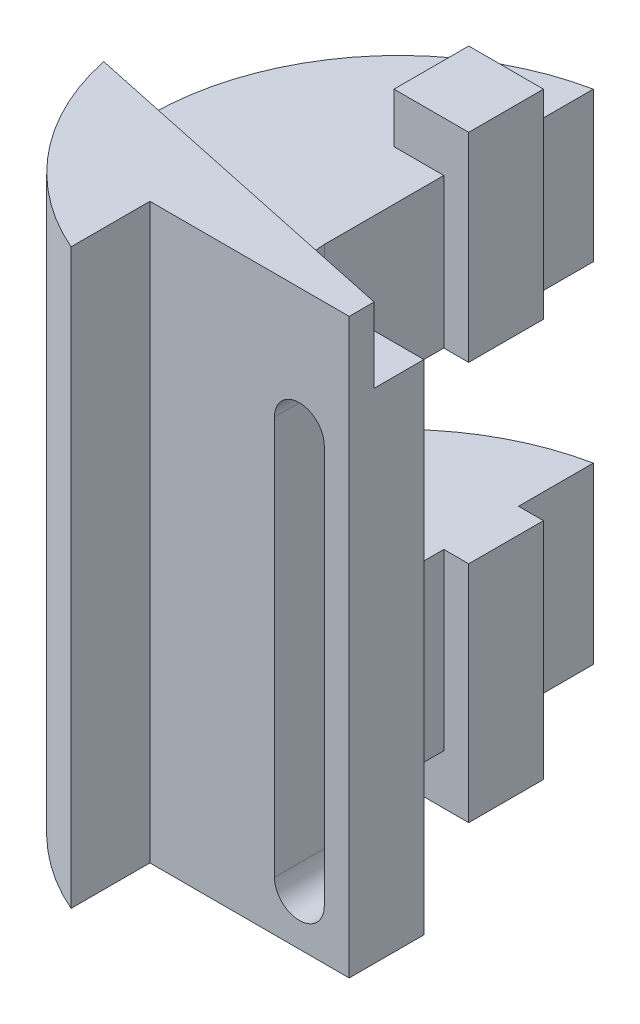
ISO-10303-21;
HEADER;
FILE_DESCRIPTION(('STEP AP214'),'2;1');
FILE_NAME('part.step','',(''),(''),'','','');
FILE_SCHEMA(('AUTOMOTIVE_DESIGN { 1 0 10303 214 1 1 1 1 }'));
ENDSEC;
DATA;
#1=APPLICATION_CONTEXT('core data for automotive mechanical design processes');
#2=APPLICATION_PROTOCOL_DEFINITION('international standard','automotive_design',2000,#1);
#3=PRODUCT_CONTEXT('',#1,'mechanical');
#4=PRODUCT('Part','Part','',(#3));
#5=PRODUCT_RELATED_PRODUCT_CATEGORY('part','',(#4));
#6=PRODUCT_DEFINITION_FORMATION('','',#4);
#7=PRODUCT_DEFINITION_CONTEXT('part definition',#1,'design');
#8=PRODUCT_DEFINITION('design','',#6,#7);
#9=PRODUCT_DEFINITION_SHAPE('','',#8);
#10=(LENGTH_UNIT() NAMED_UNIT(*) SI_UNIT(.MILLI.,.METRE.));
#11=(NAMED_UNIT(*) PLANE_ANGLE_UNIT() SI_UNIT($,.RADIAN.));
#12=(NAMED_UNIT(*) SI_UNIT($,.STERADIAN.) SOLID_ANGLE_UNIT());
#13=UNCERTAINTY_MEASURE_WITH_UNIT(LENGTH_MEASURE(1.E-05),#10,'distance_accuracy_value','');
#14=(GEOMETRIC_REPRESENTATION_CONTEXT(3) GLOBAL_UNCERTAINTY_ASSIGNED_CONTEXT((#13)) GLOBAL_UNIT_ASSIGNED_CONTEXT((#10,
#11,#12)) REPRESENTATION_CONTEXT('',''));
#15=CARTESIAN_POINT('',(0.,0.,0.));
#16=DIRECTION('',(0.,0.,1.));
#17=DIRECTION('',(1.,0.,0.));
#18=AXIS2_PLACEMENT_3D('',#15,#16,#17);
#19=CARTESIAN_POINT('',(-30.,125.,-15.));
#20=DIRECTION('',(0.,0.,1.));
#21=DIRECTION('',(1.,0.,0.));
#22=AXIS2_PLACEMENT_3D('',#19,#20,#21);
#23=PLANE('',#22);
#24=DIRECTION('',(1.,0.,0.));
#25=VECTOR('',#24,1.);
#26=CARTESIAN_POINT('',(-30.,10.,-15.));
#27=LINE('',#26,#25);
#28=CARTESIAN_POINT('',(-20.,10.,-15.));
#29=VERTEX_POINT('',#28);
#30=CARTESIAN_POINT('',(0.,10.,-15.));
#31=VERTEX_POINT('',#30);
#32=EDGE_CURVE('E342',#29,#31,#27,.T.);
#33=ORIENTED_EDGE('',*,*,#32,.F.);
#34=DIRECTION('',(0.,-1.,0.));
#35=VECTOR('',#34,1.);
#36=CARTESIAN_POINT('',(-20.,110.,-15.));
#37=LINE('',#36,#35);
#38=CARTESIAN_POINT('',(-20.,110.,-15.));
#39=VERTEX_POINT('',#38);
#40=EDGE_CURVE('E419',#29,#39,#37,.F.);
#41=ORIENTED_EDGE('',*,*,#40,.T.);
#42=DIRECTION('',(-1.,0.,0.));
#43=VECTOR('',#42,1.);
#44=CARTESIAN_POINT('',(-30.,110.,-15.));
#45=LINE('',#44,#43);
#46=CARTESIAN_POINT('',(0.,110.,-15.));
#47=VERTEX_POINT('',#46);
#48=EDGE_CURVE('E308',#47,#39,#45,.T.);
#49=ORIENTED_EDGE('',*,*,#48,.F.);
#50=DIRECTION('',(0.,-1.,0.));
#51=VECTOR('',#50,1.);
#52=CARTESIAN_POINT('',(0.,125.,-15.));
#53=LINE('',#52,#51);
#54=EDGE_CURVE('E413',#47,#31,#53,.T.);
#55=ORIENTED_EDGE('',*,*,#54,.T.);
#56=EDGE_LOOP('',(#33,#41,#49,#55));
#57=FACE_BOUND('',#56,.T.);
#58=CARTESIAN_POINT('',(-10.,20.,-15.));
#59=DIRECTION('',(0.,0.,-1.));
#60=DIRECTION('',(-1.,0.,0.));
#61=AXIS2_PLACEMENT_3D('',#58,#59,#60);
#62=CIRCLE('',#61,5.);
#63=CARTESIAN_POINT('',(-15.,20.,-15.));
#64=VERTEX_POINT('',#63);
#65=CARTESIAN_POINT('',(-5.,20.,-15.));
#66=VERTEX_POINT('',#65);
#67=EDGE_CURVE('E234',#64,#66,#62,.F.);
#68=ORIENTED_EDGE('',*,*,#67,.T.);
#69=DIRECTION('',(0.,-1.,0.));
#70=VECTOR('',#69,1.);
#71=CARTESIAN_POINT('',(-5.00000000000001,0.,-15.));
#72=LINE('',#71,#70);
#73=CARTESIAN_POINT('',(-5.,100.,-15.));
#74=VERTEX_POINT('',#73);
#75=EDGE_CURVE('E52',#74,#66,#72,.T.);
#76=ORIENTED_EDGE('',*,*,#75,.F.);
#77=CARTESIAN_POINT('',(-10.,100.,-15.));
#78=DIRECTION('',(0.,0.,-1.));
#79=DIRECTION('',(-1.,0.,0.));
#80=AXIS2_PLACEMENT_3D('',#77,#78,#79);
#81=CIRCLE('',#80,5.);
#82=CARTESIAN_POINT('',(-15.,100.,-15.));
#83=VERTEX_POINT('',#82);
#84=EDGE_CURVE('E239',#83,#74,#81,.T.);
#85=ORIENTED_EDGE('',*,*,#84,.F.);
#86=DIRECTION('',(0.,-1.,0.));
#87=VECTOR('',#86,1.);
#88=CARTESIAN_POINT('',(-15.,0.,-15.));
#89=LINE('',#88,#87);
#90=EDGE_CURVE('E225',#83,#64,#89,.T.);
#91=ORIENTED_EDGE('',*,*,#90,.T.);
#92=EDGE_LOOP('',(#68,#76,#85,#91));
#93=FACE_BOUND('',#92,.T.);
#94=ADVANCED_FACE('F37',(#57,#93),#23,.F.);
#95=CARTESIAN_POINT('',(0.,125.,0.));
#96=DIRECTION('',(0.,0.,-1.));
#97=DIRECTION('',(-1.,0.,0.));
#98=AXIS2_PLACEMENT_3D('',#95,#96,#97);
#99=PLANE('',#98);
#100=DIRECTION('',(-1.,0.,0.));
#101=VECTOR('',#100,1.);
#102=CARTESIAN_POINT('',(0.,10.,0.));
#103=LINE('',#102,#101);
#104=CARTESIAN_POINT('',(0.,10.,0.));
#105=VERTEX_POINT('',#104);
#106=CARTESIAN_POINT('',(-40.,10.,0.));
#107=VERTEX_POINT('',#106);
#108=EDGE_CURVE('E346',#105,#107,#103,.T.);
#109=ORIENTED_EDGE('',*,*,#108,.F.);
#110=DIRECTION('',(0.,-1.,0.));
#111=VECTOR('',#110,1.);
#112=CARTESIAN_POINT('',(0.,125.,0.));
#113=LINE('',#112,#111);
#114=CARTESIAN_POINT('',(0.,125.,0.));
#115=VERTEX_POINT('',#114);
#116=EDGE_CURVE('E378',#115,#105,#113,.T.);
#117=ORIENTED_EDGE('',*,*,#116,.F.);
#118=DIRECTION('',(1.,0.,0.));
#119=VECTOR('',#118,1.);
#120=CARTESIAN_POINT('',(0.,125.,0.));
#121=LINE('',#120,#119);
#122=CARTESIAN_POINT('',(-40.,125.,0.));
#123=VERTEX_POINT('',#122);
#124=EDGE_CURVE('E376',#123,#115,#121,.T.);
#125=ORIENTED_EDGE('',*,*,#124,.F.);
#126=DIRECTION('',(0.,-1.,0.));
#127=VECTOR('',#126,1.);
#128=CARTESIAN_POINT('',(-40.,125.,0.));
#129=LINE('',#128,#127);
#130=EDGE_CURVE('E387',#123,#107,#129,.T.);
#131=ORIENTED_EDGE('',*,*,#130,.T.);
#132=EDGE_LOOP('',(#109,#117,#125,#131));
#133=FACE_BOUND('',#132,.T.);
#134=CARTESIAN_POINT('',(-10.,100.,0.));
#135=DIRECTION('',(0.,0.,-1.));
#136=DIRECTION('',(-1.,0.,0.));
#137=AXIS2_PLACEMENT_3D('',#134,#135,#136);
#138=CIRCLE('',#137,5.);
#139=CARTESIAN_POINT('',(-15.,100.,0.));
#140=VERTEX_POINT('',#139);
#141=CARTESIAN_POINT('',(-5.,100.,0.));
#142=VERTEX_POINT('',#141);
#143=EDGE_CURVE('E45',#140,#142,#138,.T.);
#144=ORIENTED_EDGE('',*,*,#143,.T.);
#145=DIRECTION('',(0.,-1.,0.));
#146=VECTOR('',#145,1.);
#147=CARTESIAN_POINT('',(-5.,125.,0.));
#148=LINE('',#147,#146);
#149=CARTESIAN_POINT('',(-5.,20.,0.));
#150=VERTEX_POINT('',#149);
#151=EDGE_CURVE('E11',#142,#150,#148,.T.);
#152=ORIENTED_EDGE('',*,*,#151,.T.);
#153=CARTESIAN_POINT('',(-10.,20.,0.));
#154=DIRECTION('',(0.,0.,-1.));
#155=DIRECTION('',(-1.,0.,0.));
#156=AXIS2_PLACEMENT_3D('',#153,#154,#155);
#157=CIRCLE('',#156,5.);
#158=CARTESIAN_POINT('',(-15.,20.,0.));
#159=VERTEX_POINT('',#158);
#160=EDGE_CURVE('E434',#159,#150,#157,.F.);
#161=ORIENTED_EDGE('',*,*,#160,.F.);
#162=DIRECTION('',(0.,-1.,0.));
#163=VECTOR('',#162,1.);
#164=CARTESIAN_POINT('',(-15.,125.,0.));
#165=LINE('',#164,#163);
#166=EDGE_CURVE('E228',#140,#159,#165,.T.);
#167=ORIENTED_EDGE('',*,*,#166,.F.);
#168=EDGE_LOOP('',(#144,#152,#161,#167));
#169=FACE_BOUND('',#168,.T.);
#170=ADVANCED_FACE('F438',(#133,#169),#99,.F.);
#171=CARTESIAN_POINT('',(-20.,110.,-30.));
#172=DIRECTION('',(0.,1.,0.));
#173=DIRECTION('',(0.,0.,1.));
#174=AXIS2_PLACEMENT_3D('',#171,#172,#173);
#175=PLANE('',#174);
#176=CARTESIAN_POINT('',(-20.,110.,-30.));
#177=DIRECTION('',(0.,1.,0.));
#178=DIRECTION('',(0.,0.,1.));
#179=AXIS2_PLACEMENT_3D('',#176,#177,#178);
#180=CIRCLE('',#179,50.);
#181=CARTESIAN_POINT('',(-30.,110.,-78.9897948556636));
#182=VERTEX_POINT('',#181);
#183=CARTESIAN_POINT('',(-68.916774738474,110.,-19.6487126797972));
#184=VERTEX_POINT('',#183);
#185=EDGE_CURVE('E304',#182,#184,#180,.T.);
#186=ORIENTED_EDGE('',*,*,#185,.T.);
#187=DIRECTION('',(-0.978147600733806,0.,-0.207911690817756));
#188=VECTOR('',#187,1.);
#189=CARTESIAN_POINT('',(0.,110.,-5.));
#190=LINE('',#189,#188);
#191=CARTESIAN_POINT('',(0.,110.,-5.));
#192=VERTEX_POINT('',#191);
#193=EDGE_CURVE('E246',#192,#184,#190,.T.);
#194=ORIENTED_EDGE('',*,*,#193,.F.);
#195=DIRECTION('',(0.,0.,-1.));
#196=VECTOR('',#195,1.);
#197=CARTESIAN_POINT('',(0.,110.,-15.));
#198=LINE('',#197,#196);
#199=EDGE_CURVE('E306',#192,#47,#198,.T.);
#200=ORIENTED_EDGE('',*,*,#199,.T.);
#201=ORIENTED_EDGE('',*,*,#48,.T.);
#202=CARTESIAN_POINT('',(-20.,110.,-25.));
#203=DIRECTION('',(0.,1.,0.));
#204=DIRECTION('',(0.,0.,1.));
#205=AXIS2_PLACEMENT_3D('',#202,#203,#204);
#206=CIRCLE('',#205,10.);
#207=CARTESIAN_POINT('',(-30.,110.,-25.));
#208=VERTEX_POINT('',#207);
#209=EDGE_CURVE('E423',#39,#208,#206,.F.);
#210=ORIENTED_EDGE('',*,*,#209,.T.);
#211=DIRECTION('',(0.,0.,-1.));
#212=VECTOR('',#211,1.);
#213=CARTESIAN_POINT('',(-30.,110.,-48.9897948556636));
#214=LINE('',#213,#212);
#215=CARTESIAN_POINT('',(-30.,110.,-48.9897948556636));
#216=VERTEX_POINT('',#215);
#217=EDGE_CURVE('E311',#208,#216,#214,.T.);
#218=ORIENTED_EDGE('',*,*,#217,.T.);
#219=DIRECTION('',(-1.,0.,0.));
#220=VECTOR('',#219,1.);
#221=CARTESIAN_POINT('',(-30.,110.,-48.9897948556636));
#222=LINE('',#221,#220);
#223=CARTESIAN_POINT('',(-40.,110.,-48.9897948556636));
#224=VERTEX_POINT('',#223);
#225=EDGE_CURVE('E313',#216,#224,#222,.T.);
#226=ORIENTED_EDGE('',*,*,#225,.T.);
#227=DIRECTION('',(0.,0.,-1.));
#228=VECTOR('',#227,1.);
#229=CARTESIAN_POINT('',(-40.,110.,-48.9897948556636));
#230=LINE('',#229,#228);
#231=CARTESIAN_POINT('',(-40.,110.,-63.9897948556636));
#232=VERTEX_POINT('',#231);
#233=EDGE_CURVE('E297',#224,#232,#230,.T.);
#234=ORIENTED_EDGE('',*,*,#233,.T.);
#235=DIRECTION('',(1.,0.,0.));
#236=VECTOR('',#235,1.);
#237=CARTESIAN_POINT('',(-30.,110.,-63.9897948556636));
#238=LINE('',#237,#236);
#239=CARTESIAN_POINT('',(-30.,110.,-63.9897948556636));
#240=VERTEX_POINT('',#239);
#241=EDGE_CURVE('E300',#232,#240,#238,.T.);
#242=ORIENTED_EDGE('',*,*,#241,.T.);
#243=DIRECTION('',(0.,0.,-1.));
#244=VECTOR('',#243,1.);
#245=CARTESIAN_POINT('',(-30.,110.,-63.9897948556636));
#246=LINE('',#245,#244);
#247=EDGE_CURVE('E302',#240,#182,#246,.T.);
#248=ORIENTED_EDGE('',*,*,#247,.T.);
#249=EDGE_LOOP('',(#186,#194,#200,#201,#210,#218,#226,#234,#242,#248));
#250=FACE_BOUND('',#249,.T.);
#251=ADVANCED_FACE('F461',(#250),#175,.T.);
#252=CARTESIAN_POINT('',(-30.,125.,-63.9897948556636));
#253=DIRECTION('',(-1.,0.,0.));
#254=DIRECTION('',(0.,0.,1.));
#255=AXIS2_PLACEMENT_3D('',#252,#253,#254);
#256=PLANE('',#255);
#257=DIRECTION('',(0.,-1.,0.));
#258=VECTOR('',#257,1.);
#259=CARTESIAN_POINT('',(-30.,125.,-63.9897948556636));
#260=LINE('',#259,#258);
#261=CARTESIAN_POINT('',(-30.,80.,-63.9897948556636));
#262=VERTEX_POINT('',#261);
#263=EDGE_CURVE('E398',#240,#262,#260,.T.);
#264=ORIENTED_EDGE('',*,*,#263,.T.);
#265=DIRECTION('',(0.,0.,-1.));
#266=VECTOR('',#265,1.);
#267=CARTESIAN_POINT('',(-30.,80.,-63.9897948556636));
#268=LINE('',#267,#266);
#269=CARTESIAN_POINT('',(-30.,80.,-78.9897948556636));
#270=VERTEX_POINT('',#269);
#271=EDGE_CURVE('E281',#262,#270,#268,.T.);
#272=ORIENTED_EDGE('',*,*,#271,.T.);
#273=DIRECTION('',(0.,-1.,0.));
#274=VECTOR('',#273,1.);
#275=CARTESIAN_POINT('',(-30.,125.,-78.9897948556636));
#276=LINE('',#275,#274);
#277=EDGE_CURVE('E394',#182,#270,#276,.T.);
#278=ORIENTED_EDGE('',*,*,#277,.F.);
#279=ORIENTED_EDGE('',*,*,#247,.F.);
#280=EDGE_LOOP('',(#264,#272,#278,#279));
#281=FACE_BOUND('',#280,.T.);
#282=ADVANCED_FACE('F544',(#281),#256,.F.);
#283=CARTESIAN_POINT('',(-25.,125.,-48.9897948556636));
#284=DIRECTION('',(0.,0.,-1.));
#285=DIRECTION('',(-1.,0.,0.));
#286=AXIS2_PLACEMENT_3D('',#283,#284,#285);
#287=PLANE('',#286);
#288=DIRECTION('',(0.,-1.,0.));
#289=VECTOR('',#288,1.);
#290=CARTESIAN_POINT('',(-30.,125.,-48.9897948556636));
#291=LINE('',#290,#289);
#292=CARTESIAN_POINT('',(-30.,80.,-48.9897948556636));
#293=VERTEX_POINT('',#292);
#294=EDGE_CURVE('E410',#216,#293,#291,.T.);
#295=ORIENTED_EDGE('',*,*,#294,.T.);
#296=DIRECTION('',(1.,0.,0.));
#297=VECTOR('',#296,1.);
#298=CARTESIAN_POINT('',(-25.,80.,-48.9897948556636));
#299=LINE('',#298,#297);
#300=CARTESIAN_POINT('',(-25.,80.,-48.9897948556636));
#301=VERTEX_POINT('',#300);
#302=EDGE_CURVE('E290',#293,#301,#299,.T.);
#303=ORIENTED_EDGE('',*,*,#302,.T.);
#304=DIRECTION('',(0.,-1.,0.));
#305=VECTOR('',#304,1.);
#306=CARTESIAN_POINT('',(-25.,125.,-48.9897948556636));
#307=LINE('',#306,#305);
#308=CARTESIAN_POINT('',(-25.,120.,-48.9897948556636));
#309=VERTEX_POINT('',#308);
#310=EDGE_CURVE('E406',#309,#301,#307,.T.);
#311=ORIENTED_EDGE('',*,*,#310,.F.);
#312=DIRECTION('',(1.,0.,0.));
#313=VECTOR('',#312,1.);
#314=CARTESIAN_POINT('',(-30.,120.,-48.9897948556636));
#315=LINE('',#314,#313);
#316=CARTESIAN_POINT('',(-40.,120.,-48.9897948556636));
#317=VERTEX_POINT('',#316);
#318=EDGE_CURVE('E322',#317,#309,#315,.T.);
#319=ORIENTED_EDGE('',*,*,#318,.F.);
#320=DIRECTION('',(0.,1.,0.));
#321=VECTOR('',#320,1.);
#322=CARTESIAN_POINT('',(-40.,110.,-48.9897948556636));
#323=LINE('',#322,#321);
#324=EDGE_CURVE('E319',#224,#317,#323,.T.);
#325=ORIENTED_EDGE('',*,*,#324,.F.);
#326=ORIENTED_EDGE('',*,*,#225,.F.);
#327=EDGE_LOOP('',(#295,#303,#311,#319,#325,#326));
#328=FACE_BOUND('',#327,.T.);
#329=ADVANCED_FACE('F532',(#328),#287,.F.);
#330=CARTESIAN_POINT('',(-25.,125.,-63.9897948556636));
#331=DIRECTION('',(-1.,0.,0.));
#332=DIRECTION('',(0.,0.,1.));
#333=AXIS2_PLACEMENT_3D('',#330,#331,#332);
#334=PLANE('',#333);
#335=ORIENTED_EDGE('',*,*,#310,.T.);
#336=DIRECTION('',(0.,0.,-1.));
#337=VECTOR('',#336,1.);
#338=CARTESIAN_POINT('',(-25.,80.,-63.9897948556636));
#339=LINE('',#338,#337);
#340=CARTESIAN_POINT('',(-25.,80.,-63.9897948556636));
#341=VERTEX_POINT('',#340);
#342=EDGE_CURVE('E287',#301,#341,#339,.T.);
#343=ORIENTED_EDGE('',*,*,#342,.T.);
#344=DIRECTION('',(0.,-1.,0.));
#345=VECTOR('',#344,1.);
#346=CARTESIAN_POINT('',(-25.,125.,-63.9897948556636));
#347=LINE('',#346,#345);
#348=CARTESIAN_POINT('',(-25.,120.,-63.9897948556636));
#349=VERTEX_POINT('',#348);
#350=EDGE_CURVE('E402',#349,#341,#347,.T.);
#351=ORIENTED_EDGE('',*,*,#350,.F.);
#352=DIRECTION('',(0.,0.,-1.));
#353=VECTOR('',#352,1.);
#354=CARTESIAN_POINT('',(-25.,120.,-48.9897948556636));
#355=LINE('',#354,#353);
#356=EDGE_CURVE('E326',#309,#349,#355,.T.);
#357=ORIENTED_EDGE('',*,*,#356,.F.);
#358=EDGE_LOOP('',(#335,#343,#351,#357));
#359=FACE_BOUND('',#358,.T.);
#360=ADVANCED_FACE('F573',(#359),#334,.F.);
#361=CARTESIAN_POINT('',(-30.,125.,-63.9897948556636));
#362=DIRECTION('',(0.,0.,1.));
#363=DIRECTION('',(1.,0.,0.));
#364=AXIS2_PLACEMENT_3D('',#361,#362,#363);
#365=PLANE('',#364);
#366=ORIENTED_EDGE('',*,*,#350,.T.);
#367=DIRECTION('',(-1.,0.,0.));
#368=VECTOR('',#367,1.);
#369=CARTESIAN_POINT('',(-30.,80.,-63.9897948556636));
#370=LINE('',#369,#368);
#371=EDGE_CURVE('E284',#341,#262,#370,.T.);
#372=ORIENTED_EDGE('',*,*,#371,.T.);
#373=ORIENTED_EDGE('',*,*,#263,.F.);
#374=ORIENTED_EDGE('',*,*,#241,.F.);
#375=DIRECTION('',(0.,1.,0.));
#376=VECTOR('',#375,1.);
#377=CARTESIAN_POINT('',(-40.,110.,-63.9897948556636));
#378=LINE('',#377,#376);
#379=CARTESIAN_POINT('',(-40.,120.,-63.9897948556636));
#380=VERTEX_POINT('',#379);
#381=EDGE_CURVE('E316',#232,#380,#378,.T.);
#382=ORIENTED_EDGE('',*,*,#381,.T.);
#383=DIRECTION('',(-1.,0.,0.));
#384=VECTOR('',#383,1.);
#385=CARTESIAN_POINT('',(-25.,120.,-63.9897948556636));
#386=LINE('',#385,#384);
#387=EDGE_CURVE('E328',#349,#380,#386,.T.);
#388=ORIENTED_EDGE('',*,*,#387,.F.);
#389=EDGE_LOOP('',(#366,#372,#373,#374,#382,#388));
#390=FACE_BOUND('',#389,.T.);
#391=ADVANCED_FACE('F483',(#390),#365,.F.);
#392=CARTESIAN_POINT('',(-30.,125.,-15.));
#393=DIRECTION('',(-1.,0.,0.));
#394=DIRECTION('',(0.,0.,1.));
#395=AXIS2_PLACEMENT_3D('',#392,#393,#394);
#396=PLANE('',#395);
#397=DIRECTION('',(0.,1.,0.));
#398=VECTOR('',#397,1.);
#399=CARTESIAN_POINT('',(-30.,125.,-38.9897948556636));
#400=LINE('',#399,#398);
#401=CARTESIAN_POINT('',(-30.,45.,-38.9897948556636));
#402=VERTEX_POINT('',#401);
#403=CARTESIAN_POINT('',(-30.,80.,-38.9897948556636));
#404=VERTEX_POINT('',#403);
#405=EDGE_CURVE('E261',#402,#404,#400,.T.);
#406=ORIENTED_EDGE('',*,*,#405,.T.);
#407=DIRECTION('',(0.,0.,-1.));
#408=VECTOR('',#407,1.);
#409=CARTESIAN_POINT('',(-30.,80.,-15.));
#410=LINE('',#409,#408);
#411=EDGE_CURVE('E293',#404,#293,#410,.T.);
#412=ORIENTED_EDGE('',*,*,#411,.T.);
#413=ORIENTED_EDGE('',*,*,#294,.F.);
#414=ORIENTED_EDGE('',*,*,#217,.F.);
#415=DIRECTION('',(0.,-1.,0.));
#416=VECTOR('',#415,1.);
#417=CARTESIAN_POINT('',(-30.,9.99999999999999,-25.));
#418=LINE('',#417,#416);
#419=CARTESIAN_POINT('',(-30.,10.,-25.));
#420=VERTEX_POINT('',#419);
#421=EDGE_CURVE('E416',#208,#420,#418,.T.);
#422=ORIENTED_EDGE('',*,*,#421,.T.);
#423=DIRECTION('',(0.,0.,1.));
#424=VECTOR('',#423,1.);
#425=CARTESIAN_POINT('',(-30.,10.,-48.9897948556636));
#426=LINE('',#425,#424);
#427=CARTESIAN_POINT('',(-30.,10.,-48.9897948556636));
#428=VERTEX_POINT('',#427);
#429=EDGE_CURVE('E339',#428,#420,#426,.T.);
#430=ORIENTED_EDGE('',*,*,#429,.F.);
#431=CARTESIAN_POINT('',(-30.,45.,-48.9897948556636));
#432=VERTEX_POINT('',#431);
#433=EDGE_CURVE('E409',#432,#428,#291,.T.);
#434=ORIENTED_EDGE('',*,*,#433,.F.);
#435=DIRECTION('',(0.,0.,1.));
#436=VECTOR('',#435,1.);
#437=CARTESIAN_POINT('',(-30.,45.,-15.));
#438=LINE('',#437,#436);
#439=EDGE_CURVE('E278',#432,#402,#438,.T.);
#440=ORIENTED_EDGE('',*,*,#439,.T.);
#441=EDGE_LOOP('',(#406,#412,#413,#414,#422,#430,#434,#440));
#442=FACE_BOUND('',#441,.T.);
#443=ADVANCED_FACE('F466',(#442),#396,.F.);
#444=CARTESIAN_POINT('',(-30.,45.,-78.9897948556636));
#445=VERTEX_POINT('',#444);
#446=CARTESIAN_POINT('',(-30.,10.,-78.9897948556636));
#447=VERTEX_POINT('',#446);
#448=EDGE_CURVE('E393',#445,#447,#276,.T.);
#449=ORIENTED_EDGE('',*,*,#448,.F.);
#450=DIRECTION('',(0.,0.,1.));
#451=VECTOR('',#450,1.);
#452=CARTESIAN_POINT('',(-30.,45.,-63.9897948556636));
#453=LINE('',#452,#451);
#454=CARTESIAN_POINT('',(-30.,45.,-63.9897948556636));
#455=VERTEX_POINT('',#454);
#456=EDGE_CURVE('E266',#445,#455,#453,.T.);
#457=ORIENTED_EDGE('',*,*,#456,.T.);
#458=CARTESIAN_POINT('',(-30.,10.,-63.9897948556636));
#459=VERTEX_POINT('',#458);
#460=EDGE_CURVE('E397',#455,#459,#260,.T.);
#461=ORIENTED_EDGE('',*,*,#460,.T.);
#462=DIRECTION('',(0.,0.,1.));
#463=VECTOR('',#462,1.);
#464=CARTESIAN_POINT('',(-30.,10.,-63.9897948556636));
#465=LINE('',#464,#463);
#466=EDGE_CURVE('E353',#447,#459,#465,.T.);
#467=ORIENTED_EDGE('',*,*,#466,.F.);
#468=EDGE_LOOP('',(#449,#457,#461,#467));
#469=FACE_BOUND('',#468,.T.);
#470=ADVANCED_FACE('F510',(#469),#256,.F.);
#471=CARTESIAN_POINT('',(-25.,45.,-48.9897948556636));
#472=VERTEX_POINT('',#471);
#473=CARTESIAN_POINT('',(-25.,0.,-48.9897948556636));
#474=VERTEX_POINT('',#473);
#475=EDGE_CURVE('E405',#472,#474,#307,.T.);
#476=ORIENTED_EDGE('',*,*,#475,.F.);
#477=DIRECTION('',(-1.,0.,0.));
#478=VECTOR('',#477,1.);
#479=CARTESIAN_POINT('',(-25.,45.,-48.9897948556636));
#480=LINE('',#479,#478);
#481=EDGE_CURVE('E275',#472,#432,#480,.T.);
#482=ORIENTED_EDGE('',*,*,#481,.T.);
#483=ORIENTED_EDGE('',*,*,#433,.T.);
#484=DIRECTION('',(1.,0.,0.));
#485=VECTOR('',#484,1.);
#486=CARTESIAN_POINT('',(-30.,10.,-48.9897948556636));
#487=LINE('',#486,#485);
#488=CARTESIAN_POINT('',(-40.,10.,-48.9897948556636));
#489=VERTEX_POINT('',#488);
#490=EDGE_CURVE('E336',#489,#428,#487,.T.);
#491=ORIENTED_EDGE('',*,*,#490,.F.);
#492=DIRECTION('',(0.,-1.,0.));
#493=VECTOR('',#492,1.);
#494=CARTESIAN_POINT('',(-40.,10.,-48.9897948556636));
#495=LINE('',#494,#493);
#496=CARTESIAN_POINT('',(-40.,0.,-48.9897948556636));
#497=VERTEX_POINT('',#496);
#498=EDGE_CURVE('E359',#489,#497,#495,.T.);
#499=ORIENTED_EDGE('',*,*,#498,.T.);
#500=DIRECTION('',(1.,0.,0.));
#501=VECTOR('',#500,1.);
#502=CARTESIAN_POINT('',(-25.,0.,-48.9897948556636));
#503=LINE('',#502,#501);
#504=EDGE_CURVE('E365',#497,#474,#503,.T.);
#505=ORIENTED_EDGE('',*,*,#504,.T.);
#506=EDGE_LOOP('',(#476,#482,#483,#491,#499,#505));
#507=FACE_BOUND('',#506,.T.);
#508=ADVANCED_FACE('F521',(#507),#287,.F.);
#509=CARTESIAN_POINT('',(-25.,45.,-63.9897948556636));
#510=VERTEX_POINT('',#509);
#511=CARTESIAN_POINT('',(-25.,0.,-63.9897948556636));
#512=VERTEX_POINT('',#511);
#513=EDGE_CURVE('E401',#510,#512,#347,.T.);
#514=ORIENTED_EDGE('',*,*,#513,.F.);
#515=DIRECTION('',(0.,0.,1.));
#516=VECTOR('',#515,1.);
#517=CARTESIAN_POINT('',(-25.,45.,-63.9897948556636));
#518=LINE('',#517,#516);
#519=EDGE_CURVE('E272',#510,#472,#518,.T.);
#520=ORIENTED_EDGE('',*,*,#519,.T.);
#521=ORIENTED_EDGE('',*,*,#475,.T.);
#522=DIRECTION('',(0.,0.,-1.));
#523=VECTOR('',#522,1.);
#524=CARTESIAN_POINT('',(-25.,0.,-63.9897948556636));
#525=LINE('',#524,#523);
#526=EDGE_CURVE('E381',#474,#512,#525,.T.);
#527=ORIENTED_EDGE('',*,*,#526,.T.);
#528=EDGE_LOOP('',(#514,#520,#521,#527));
#529=FACE_BOUND('',#528,.T.);
#530=ADVANCED_FACE('F480',(#529),#334,.F.);
#531=ORIENTED_EDGE('',*,*,#460,.F.);
#532=DIRECTION('',(1.,0.,0.));
#533=VECTOR('',#532,1.);
#534=CARTESIAN_POINT('',(-30.,45.,-63.9897948556636));
#535=LINE('',#534,#533);
#536=EDGE_CURVE('E269',#455,#510,#535,.T.);
#537=ORIENTED_EDGE('',*,*,#536,.T.);
#538=ORIENTED_EDGE('',*,*,#513,.T.);
#539=DIRECTION('',(-1.,0.,0.));
#540=VECTOR('',#539,1.);
#541=CARTESIAN_POINT('',(-30.,0.,-63.9897948556636));
#542=LINE('',#541,#540);
#543=CARTESIAN_POINT('',(-40.,0.,-63.9897948556636));
#544=VERTEX_POINT('',#543);
#545=EDGE_CURVE('E372',#512,#544,#542,.T.);
#546=ORIENTED_EDGE('',*,*,#545,.T.);
#547=DIRECTION('',(0.,-1.,0.));
#548=VECTOR('',#547,1.);
#549=CARTESIAN_POINT('',(-40.,10.,-63.9897948556636));
#550=LINE('',#549,#548);
#551=CARTESIAN_POINT('',(-40.,10.,-63.9897948556636));
#552=VERTEX_POINT('',#551);
#553=EDGE_CURVE('E362',#552,#544,#550,.T.);
#554=ORIENTED_EDGE('',*,*,#553,.F.);
#555=DIRECTION('',(-1.,0.,0.));
#556=VECTOR('',#555,1.);
#557=CARTESIAN_POINT('',(-30.,10.,-63.9897948556636));
#558=LINE('',#557,#556);
#559=EDGE_CURVE('E356',#459,#552,#558,.T.);
#560=ORIENTED_EDGE('',*,*,#559,.F.);
#561=EDGE_LOOP('',(#531,#537,#538,#546,#554,#560));
#562=FACE_BOUND('',#561,.T.);
#563=ADVANCED_FACE('F471',(#562),#365,.F.);
#564=CARTESIAN_POINT('',(0.,125.,-15.));
#565=DIRECTION('',(-1.,0.,0.));
#566=DIRECTION('',(0.,0.,1.));
#567=AXIS2_PLACEMENT_3D('',#564,#565,#566);
#568=PLANE('',#567);
#569=ORIENTED_EDGE('',*,*,#199,.F.);
#570=DIRECTION('',(0.,1.,0.));
#571=VECTOR('',#570,1.);
#572=CARTESIAN_POINT('',(0.,120.,-5.));
#573=LINE('',#572,#571);
#574=CARTESIAN_POINT('',(0.,125.,-5.));
#575=VERTEX_POINT('',#574);
#576=EDGE_CURVE('E330',#192,#575,#573,.T.);
#577=ORIENTED_EDGE('',*,*,#576,.T.);
#578=DIRECTION('',(0.,0.,-1.));
#579=VECTOR('',#578,1.);
#580=CARTESIAN_POINT('',(0.,125.,-15.));
#581=LINE('',#580,#579);
#582=EDGE_CURVE('E368',#115,#575,#581,.T.);
#583=ORIENTED_EDGE('',*,*,#582,.F.);
#584=ORIENTED_EDGE('',*,*,#116,.T.);
#585=DIRECTION('',(0.,0.,1.));
#586=VECTOR('',#585,1.);
#587=CARTESIAN_POINT('',(0.,10.,-15.));
#588=LINE('',#587,#586);
#589=EDGE_CURVE('E344',#31,#105,#588,.T.);
#590=ORIENTED_EDGE('',*,*,#589,.F.);
#591=ORIENTED_EDGE('',*,*,#54,.F.);
#592=EDGE_LOOP('',(#569,#577,#583,#584,#590,#591));
#593=FACE_BOUND('',#592,.T.);
#594=ADVANCED_FACE('F468',(#593),#568,.F.);
#595=CARTESIAN_POINT('',(-20.,125.,-30.));
#596=DIRECTION('',(0.,-1.,0.));
#597=DIRECTION('',(0.,0.,-1.));
#598=AXIS2_PLACEMENT_3D('',#595,#596,#597);
#599=CYLINDRICAL_SURFACE('',#598,50.);
#600=CARTESIAN_POINT('',(-20.,125.,-30.));
#601=DIRECTION('',(0.,1.,0.));
#602=DIRECTION('',(0.,0.,1.));
#603=AXIS2_PLACEMENT_3D('',#600,#601,#602);
#604=CIRCLE('',#603,50.);
#605=CARTESIAN_POINT('',(-68.916774738474,125.,-19.6487126797972));
#606=VERTEX_POINT('',#605);
#607=CARTESIAN_POINT('',(-40.,125.,15.8257569495584));
#608=VERTEX_POINT('',#607);
#609=EDGE_CURVE('E371',#606,#608,#604,.T.);
#610=ORIENTED_EDGE('',*,*,#609,.F.);
#611=DIRECTION('',(0.,-1.,0.));
#612=VECTOR('',#611,1.);
#613=CARTESIAN_POINT('',(-68.916774738474,125.,-19.6487126797972));
#614=LINE('',#613,#612);
#615=EDGE_CURVE('E252',#606,#184,#614,.T.);
#616=ORIENTED_EDGE('',*,*,#615,.T.);
#617=ORIENTED_EDGE('',*,*,#185,.F.);
#618=ORIENTED_EDGE('',*,*,#277,.T.);
#619=CARTESIAN_POINT('',(-20.,80.,-30.));
#620=DIRECTION('',(0.,1.,0.));
#621=DIRECTION('',(0.,0.,1.));
#622=AXIS2_PLACEMENT_3D('',#619,#620,#621);
#623=CIRCLE('',#622,50.);
#624=CARTESIAN_POINT('',(-69.1851968426791,80.,-38.9897948556636));
#625=VERTEX_POINT('',#624);
#626=EDGE_CURVE('E431',#270,#625,#623,.T.);
#627=ORIENTED_EDGE('',*,*,#626,.T.);
#628=DIRECTION('',(0.,-1.,0.));
#629=VECTOR('',#628,1.);
#630=CARTESIAN_POINT('',(-69.1851968426791,125.,-38.9897948556636));
#631=LINE('',#630,#629);
#632=CARTESIAN_POINT('',(-69.1851968426791,45.,-38.9897948556636));
#633=VERTEX_POINT('',#632);
#634=EDGE_CURVE('E425',#625,#633,#631,.T.);
#635=ORIENTED_EDGE('',*,*,#634,.T.);
#636=CARTESIAN_POINT('',(-20.,45.,-30.));
#637=DIRECTION('',(0.,-1.,0.));
#638=DIRECTION('',(0.,0.,-1.));
#639=AXIS2_PLACEMENT_3D('',#636,#637,#638);
#640=CIRCLE('',#639,50.);
#641=EDGE_CURVE('E428',#633,#445,#640,.T.);
#642=ORIENTED_EDGE('',*,*,#641,.T.);
#643=ORIENTED_EDGE('',*,*,#448,.T.);
#644=CARTESIAN_POINT('',(-20.,10.,-30.));
#645=DIRECTION('',(0.,-1.,0.));
#646=DIRECTION('',(0.,0.,-1.));
#647=AXIS2_PLACEMENT_3D('',#644,#645,#646);
#648=CIRCLE('',#647,50.);
#649=CARTESIAN_POINT('',(-40.,10.,15.8257569495584));
#650=VERTEX_POINT('',#649);
#651=EDGE_CURVE('E350',#650,#447,#648,.T.);
#652=ORIENTED_EDGE('',*,*,#651,.F.);
#653=DIRECTION('',(0.,-1.,0.));
#654=VECTOR('',#653,1.);
#655=CARTESIAN_POINT('',(-40.,125.,15.8257569495584));
#656=LINE('',#655,#654);
#657=EDGE_CURVE('E390',#608,#650,#656,.T.);
#658=ORIENTED_EDGE('',*,*,#657,.F.);
#659=EDGE_LOOP('',(#610,#616,#617,#618,#627,#635,#642,#643,#652,#658));
#660=FACE_BOUND('',#659,.T.);
#661=ADVANCED_FACE('F470',(#660),#599,.T.);
#662=CARTESIAN_POINT('',(-40.,125.,0.));
#663=DIRECTION('',(-1.,0.,0.));
#664=DIRECTION('',(0.,0.,1.));
#665=AXIS2_PLACEMENT_3D('',#662,#663,#664);
#666=PLANE('',#665);
#667=DIRECTION('',(0.,0.,1.));
#668=VECTOR('',#667,1.);
#669=CARTESIAN_POINT('',(-40.,10.,0.));
#670=LINE('',#669,#668);
#671=EDGE_CURVE('E348',#107,#650,#670,.T.);
#672=ORIENTED_EDGE('',*,*,#671,.F.);
#673=ORIENTED_EDGE('',*,*,#130,.F.);
#674=DIRECTION('',(0.,0.,-1.));
#675=VECTOR('',#674,1.);
#676=CARTESIAN_POINT('',(-40.,125.,0.));
#677=LINE('',#676,#675);
#678=EDGE_CURVE('E374',#608,#123,#677,.T.);
#679=ORIENTED_EDGE('',*,*,#678,.F.);
#680=ORIENTED_EDGE('',*,*,#657,.T.);
#681=EDGE_LOOP('',(#672,#673,#679,#680));
#682=FACE_BOUND('',#681,.T.);
#683=ADVANCED_FACE('F477',(#682),#666,.F.);
#684=CARTESIAN_POINT('',(-20.,125.,-30.));
#685=DIRECTION('',(0.,1.,0.));
#686=DIRECTION('',(0.,0.,1.));
#687=AXIS2_PLACEMENT_3D('',#684,#685,#686);
#688=PLANE('',#687);
#689=ORIENTED_EDGE('',*,*,#582,.T.);
#690=DIRECTION('',(-0.978147600733806,0.,-0.207911690817756));
#691=VECTOR('',#690,1.);
#692=CARTESIAN_POINT('',(0.,125.,-5.));
#693=LINE('',#692,#691);
#694=EDGE_CURVE('E249',#575,#606,#693,.T.);
#695=ORIENTED_EDGE('',*,*,#694,.T.);
#696=ORIENTED_EDGE('',*,*,#609,.T.);
#697=ORIENTED_EDGE('',*,*,#678,.T.);
#698=ORIENTED_EDGE('',*,*,#124,.T.);
#699=EDGE_LOOP('',(#689,#695,#696,#697,#698));
#700=FACE_BOUND('',#699,.T.);
#701=ADVANCED_FACE('F494',(#700),#688,.T.);
#702=CARTESIAN_POINT('',(-20.,0.,-30.));
#703=DIRECTION('',(0.,1.,0.));
#704=DIRECTION('',(0.,0.,1.));
#705=AXIS2_PLACEMENT_3D('',#702,#703,#704);
#706=PLANE('',#705);
#707=DIRECTION('',(0.,0.,1.));
#708=VECTOR('',#707,1.);
#709=CARTESIAN_POINT('',(-40.,0.,-48.9897948556636));
#710=LINE('',#709,#708);
#711=EDGE_CURVE('E332',#544,#497,#710,.T.);
#712=ORIENTED_EDGE('',*,*,#711,.F.);
#713=ORIENTED_EDGE('',*,*,#545,.F.);
#714=ORIENTED_EDGE('',*,*,#526,.F.);
#715=ORIENTED_EDGE('',*,*,#504,.F.);
#716=EDGE_LOOP('',(#712,#713,#714,#715));
#717=FACE_BOUND('',#716,.T.);
#718=ADVANCED_FACE('F558',(#717),#706,.F.);
#719=CARTESIAN_POINT('',(-40.,10.,-48.9897948556636));
#720=DIRECTION('',(1.,0.,0.));
#721=DIRECTION('',(0.,0.,-1.));
#722=AXIS2_PLACEMENT_3D('',#719,#720,#721);
#723=PLANE('',#722);
#724=ORIENTED_EDGE('',*,*,#711,.T.);
#725=ORIENTED_EDGE('',*,*,#498,.F.);
#726=DIRECTION('',(0.,0.,1.));
#727=VECTOR('',#726,1.);
#728=CARTESIAN_POINT('',(-40.,10.,-48.9897948556636));
#729=LINE('',#728,#727);
#730=EDGE_CURVE('E333',#552,#489,#729,.T.);
#731=ORIENTED_EDGE('',*,*,#730,.F.);
#732=ORIENTED_EDGE('',*,*,#553,.T.);
#733=EDGE_LOOP('',(#724,#725,#731,#732));
#734=FACE_BOUND('',#733,.T.);
#735=ADVANCED_FACE('F517',(#734),#723,.F.);
#736=CARTESIAN_POINT('',(-20.,10.,-30.));
#737=DIRECTION('',(0.,-1.,0.));
#738=DIRECTION('',(0.,0.,-1.));
#739=AXIS2_PLACEMENT_3D('',#736,#737,#738);
#740=PLANE('',#739);
#741=ORIENTED_EDGE('',*,*,#730,.T.);
#742=ORIENTED_EDGE('',*,*,#490,.T.);
#743=ORIENTED_EDGE('',*,*,#429,.T.);
#744=CARTESIAN_POINT('',(-20.,9.99999999999999,-25.));
#745=DIRECTION('',(0.,-1.,0.));
#746=DIRECTION('',(0.,0.,-1.));
#747=AXIS2_PLACEMENT_3D('',#744,#745,#746);
#748=CIRCLE('',#747,10.);
#749=EDGE_CURVE('E421',#420,#29,#748,.F.);
#750=ORIENTED_EDGE('',*,*,#749,.T.);
#751=ORIENTED_EDGE('',*,*,#32,.T.);
#752=ORIENTED_EDGE('',*,*,#589,.T.);
#753=ORIENTED_EDGE('',*,*,#108,.T.);
#754=ORIENTED_EDGE('',*,*,#671,.T.);
#755=ORIENTED_EDGE('',*,*,#651,.T.);
#756=ORIENTED_EDGE('',*,*,#466,.T.);
#757=ORIENTED_EDGE('',*,*,#559,.T.);
#758=EDGE_LOOP('',(#741,#742,#743,#750,#751,#752,#753,#754,#755,#756,#757));
#759=FACE_BOUND('',#758,.T.);
#760=ADVANCED_FACE('F502',(#759),#740,.T.);
#761=CARTESIAN_POINT('',(-20.,120.,-30.));
#762=DIRECTION('',(0.,1.,0.));
#763=DIRECTION('',(0.,0.,1.));
#764=AXIS2_PLACEMENT_3D('',#761,#762,#763);
#765=PLANE('',#764);
#766=DIRECTION('',(0.,0.,-1.));
#767=VECTOR('',#766,1.);
#768=CARTESIAN_POINT('',(-40.,120.,-48.9897948556636));
#769=LINE('',#768,#767);
#770=EDGE_CURVE('E296',#317,#380,#769,.T.);
#771=ORIENTED_EDGE('',*,*,#770,.F.);
#772=ORIENTED_EDGE('',*,*,#318,.T.);
#773=ORIENTED_EDGE('',*,*,#356,.T.);
#774=ORIENTED_EDGE('',*,*,#387,.T.);
#775=EDGE_LOOP('',(#771,#772,#773,#774));
#776=FACE_BOUND('',#775,.T.);
#777=ADVANCED_FACE('F594',(#776),#765,.T.);
#778=CARTESIAN_POINT('',(-40.,110.,-48.9897948556636));
#779=DIRECTION('',(1.,0.,0.));
#780=DIRECTION('',(0.,0.,-1.));
#781=AXIS2_PLACEMENT_3D('',#778,#779,#780);
#782=PLANE('',#781);
#783=ORIENTED_EDGE('',*,*,#770,.T.);
#784=ORIENTED_EDGE('',*,*,#381,.F.);
#785=ORIENTED_EDGE('',*,*,#233,.F.);
#786=ORIENTED_EDGE('',*,*,#324,.T.);
#787=EDGE_LOOP('',(#783,#784,#785,#786));
#788=FACE_BOUND('',#787,.T.);
#789=ADVANCED_FACE('F538',(#788),#782,.F.);
#790=CARTESIAN_POINT('',(-20.,125.,-25.));
#791=DIRECTION('',(0.,1.,0.));
#792=DIRECTION('',(0.,0.,1.));
#793=AXIS2_PLACEMENT_3D('',#790,#791,#792);
#794=CYLINDRICAL_SURFACE('',#793,10.);
#795=ORIENTED_EDGE('',*,*,#209,.F.);
#796=ORIENTED_EDGE('',*,*,#40,.F.);
#797=ORIENTED_EDGE('',*,*,#749,.F.);
#798=ORIENTED_EDGE('',*,*,#421,.F.);
#799=EDGE_LOOP('',(#795,#796,#797,#798));
#800=FACE_BOUND('',#799,.T.);
#801=ADVANCED_FACE('F39',(#800),#794,.F.);
#802=CARTESIAN_POINT('',(-70.,80.,-38.9897948556636));
#803=DIRECTION('',(0.,1.,0.));
#804=DIRECTION('',(0.,0.,1.));
#805=AXIS2_PLACEMENT_3D('',#802,#803,#804);
#806=PLANE('',#805);
#807=DIRECTION('',(1.,0.,0.));
#808=VECTOR('',#807,1.);
#809=CARTESIAN_POINT('',(-70.,80.,-38.9897948556636));
#810=LINE('',#809,#808);
#811=EDGE_CURVE('E257',#625,#404,#810,.T.);
#812=ORIENTED_EDGE('',*,*,#811,.F.);
#813=ORIENTED_EDGE('',*,*,#626,.F.);
#814=ORIENTED_EDGE('',*,*,#271,.F.);
#815=ORIENTED_EDGE('',*,*,#371,.F.);
#816=ORIENTED_EDGE('',*,*,#342,.F.);
#817=ORIENTED_EDGE('',*,*,#302,.F.);
#818=ORIENTED_EDGE('',*,*,#411,.F.);
#819=EDGE_LOOP('',(#812,#813,#814,#815,#816,#817,#818));
#820=FACE_BOUND('',#819,.T.);
#821=ADVANCED_FACE('F549',(#820),#806,.F.);
#822=CARTESIAN_POINT('',(-70.,45.,-78.9897948556636));
#823=DIRECTION('',(0.,-1.,0.));
#824=DIRECTION('',(0.,0.,-1.));
#825=AXIS2_PLACEMENT_3D('',#822,#823,#824);
#826=PLANE('',#825);
#827=ORIENTED_EDGE('',*,*,#481,.F.);
#828=ORIENTED_EDGE('',*,*,#519,.F.);
#829=ORIENTED_EDGE('',*,*,#536,.F.);
#830=ORIENTED_EDGE('',*,*,#456,.F.);
#831=ORIENTED_EDGE('',*,*,#641,.F.);
#832=DIRECTION('',(1.,0.,0.));
#833=VECTOR('',#832,1.);
#834=CARTESIAN_POINT('',(-70.,45.,-38.9897948556636));
#835=LINE('',#834,#833);
#836=EDGE_CURVE('E258',#633,#402,#835,.T.);
#837=ORIENTED_EDGE('',*,*,#836,.T.);
#838=ORIENTED_EDGE('',*,*,#439,.F.);
#839=EDGE_LOOP('',(#827,#828,#829,#830,#831,#837,#838));
#840=FACE_BOUND('',#839,.T.);
#841=ADVANCED_FACE('F553',(#840),#826,.F.);
#842=CARTESIAN_POINT('',(-70.,45.,-38.9897948556636));
#843=DIRECTION('',(0.,0.,1.));
#844=DIRECTION('',(1.,0.,0.));
#845=AXIS2_PLACEMENT_3D('',#842,#843,#844);
#846=PLANE('',#845);
#847=ORIENTED_EDGE('',*,*,#836,.F.);
#848=ORIENTED_EDGE('',*,*,#634,.F.);
#849=ORIENTED_EDGE('',*,*,#811,.T.);
#850=ORIENTED_EDGE('',*,*,#405,.F.);
#851=EDGE_LOOP('',(#847,#848,#849,#850));
#852=FACE_BOUND('',#851,.T.);
#853=ADVANCED_FACE('F451',(#852),#846,.F.);
#854=CARTESIAN_POINT('',(0.,125.,-5.));
#855=DIRECTION('',(-0.207911690817756,0.,0.978147600733806));
#856=DIRECTION('',(0.978147600733806,0.,0.207911690817756));
#857=AXIS2_PLACEMENT_3D('',#854,#855,#856);
#858=PLANE('',#857);
#859=ORIENTED_EDGE('',*,*,#193,.T.);
#860=ORIENTED_EDGE('',*,*,#615,.F.);
#861=ORIENTED_EDGE('',*,*,#694,.F.);
#862=ORIENTED_EDGE('',*,*,#576,.F.);
#863=EDGE_LOOP('',(#859,#860,#861,#862));
#864=FACE_BOUND('',#863,.T.);
#865=ADVANCED_FACE('F444',(#864),#858,.F.);
#866=CARTESIAN_POINT('',(-5.00000000000001,0.,15.8257569495584));
#867=DIRECTION('',(1.,0.,0.));
#868=DIRECTION('',(0.,1.,0.));
#869=AXIS2_PLACEMENT_3D('',#866,#867,#868);
#870=PLANE('',#869);
#871=DIRECTION('',(0.,0.,-1.));
#872=VECTOR('',#871,1.);
#873=CARTESIAN_POINT('',(-5.,100.,15.8257569495584));
#874=LINE('',#873,#872);
#875=EDGE_CURVE('E244',#142,#74,#874,.T.);
#876=ORIENTED_EDGE('',*,*,#875,.T.);
#877=ORIENTED_EDGE('',*,*,#75,.T.);
#878=DIRECTION('',(0.,0.,-1.));
#879=VECTOR('',#878,1.);
#880=CARTESIAN_POINT('',(-5.,20.,15.8257569495584));
#881=LINE('',#880,#879);
#882=EDGE_CURVE('E231',#150,#66,#881,.T.);
#883=ORIENTED_EDGE('',*,*,#882,.F.);
#884=ORIENTED_EDGE('',*,*,#151,.F.);
#885=EDGE_LOOP('',(#876,#877,#883,#884));
#886=FACE_BOUND('',#885,.T.);
#887=ADVANCED_FACE('F442',(#886),#870,.F.);
#888=CARTESIAN_POINT('',(-10.,100.,15.8257569495584));
#889=DIRECTION('',(0.,0.,-1.));
#890=DIRECTION('',(-1.,0.,0.));
#891=AXIS2_PLACEMENT_3D('',#888,#889,#890);
#892=CYLINDRICAL_SURFACE('',#891,5.);
#893=DIRECTION('',(0.,0.,-1.));
#894=VECTOR('',#893,1.);
#895=CARTESIAN_POINT('',(-15.,100.,15.8257569495584));
#896=LINE('',#895,#894);
#897=EDGE_CURVE('E230',#140,#83,#896,.T.);
#898=ORIENTED_EDGE('',*,*,#897,.T.);
#899=ORIENTED_EDGE('',*,*,#84,.T.);
#900=ORIENTED_EDGE('',*,*,#875,.F.);
#901=ORIENTED_EDGE('',*,*,#143,.F.);
#902=EDGE_LOOP('',(#898,#899,#900,#901));
#903=FACE_BOUND('',#902,.T.);
#904=ADVANCED_FACE('F441',(#903),#892,.F.);
#905=CARTESIAN_POINT('',(-15.,0.,15.8257569495584));
#906=DIRECTION('',(1.,0.,0.));
#907=DIRECTION('',(0.,1.,0.));
#908=AXIS2_PLACEMENT_3D('',#905,#906,#907);
#909=PLANE('',#908);
#910=ORIENTED_EDGE('',*,*,#166,.T.);
#911=DIRECTION('',(0.,0.,-1.));
#912=VECTOR('',#911,1.);
#913=CARTESIAN_POINT('',(-15.,20.,15.8257569495584));
#914=LINE('',#913,#912);
#915=EDGE_CURVE('E60',#159,#64,#914,.T.);
#916=ORIENTED_EDGE('',*,*,#915,.T.);
#917=ORIENTED_EDGE('',*,*,#90,.F.);
#918=ORIENTED_EDGE('',*,*,#897,.F.);
#919=EDGE_LOOP('',(#910,#916,#917,#918));
#920=FACE_BOUND('',#919,.T.);
#921=ADVANCED_FACE('F222',(#920),#909,.T.);
#922=CARTESIAN_POINT('',(-10.,20.,15.8257569495584));
#923=DIRECTION('',(0.,0.,-1.));
#924=DIRECTION('',(-1.,0.,0.));
#925=AXIS2_PLACEMENT_3D('',#922,#923,#924);
#926=CYLINDRICAL_SURFACE('',#925,5.);
#927=ORIENTED_EDGE('',*,*,#160,.T.);
#928=ORIENTED_EDGE('',*,*,#882,.T.);
#929=ORIENTED_EDGE('',*,*,#67,.F.);
#930=ORIENTED_EDGE('',*,*,#915,.F.);
#931=EDGE_LOOP('',(#927,#928,#929,#930));
#932=FACE_BOUND('',#931,.T.);
#933=ADVANCED_FACE('F235',(#932),#926,.F.);
#934=CLOSED_SHELL('',(#94,#170,#251,#282,#329,#360,#391,#443,#470,#508,#530,#563,#594,#661,#683,
#701,#718,#735,#760,#777,#789,#801,#821,#841,#853,#865,#887,#904,#921,#933));
#935=MANIFOLD_SOLID_BREP('B2',#934);
#936=ADVANCED_BREP_SHAPE_REPRESENTATION('',(#18,#935),#14);
#937=SHAPE_DEFINITION_REPRESENTATION(#9,#936);
ENDSEC;
END-ISO-10303-21;
